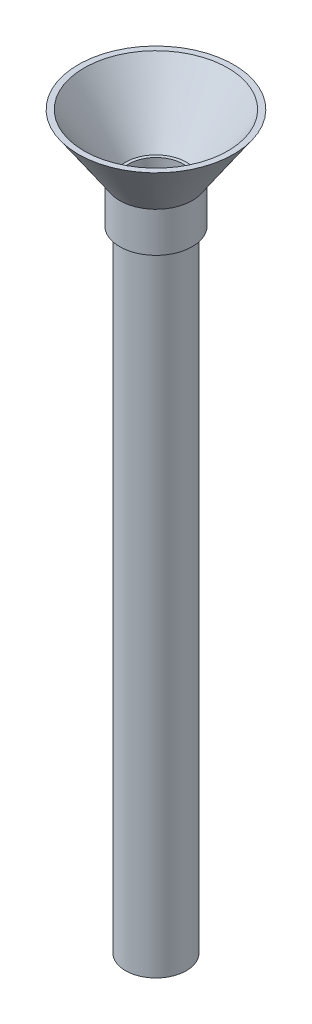
ISO-10303-21;
HEADER;
FILE_DESCRIPTION(('STEP AP214'),'2;1');
FILE_NAME('part.step','',(''),(''),'','','');
FILE_SCHEMA(('AUTOMOTIVE_DESIGN { 1 0 10303 214 1 1 1 1 }'));
ENDSEC;
DATA;
#1=APPLICATION_CONTEXT('core data for automotive mechanical design processes');
#2=APPLICATION_PROTOCOL_DEFINITION('international standard','automotive_design',2000,#1);
#3=PRODUCT_CONTEXT('',#1,'mechanical');
#4=PRODUCT('Part','Part','',(#3));
#5=PRODUCT_RELATED_PRODUCT_CATEGORY('part','',(#4));
#6=PRODUCT_DEFINITION_FORMATION('','',#4);
#7=PRODUCT_DEFINITION_CONTEXT('part definition',#1,'design');
#8=PRODUCT_DEFINITION('design','',#6,#7);
#9=PRODUCT_DEFINITION_SHAPE('','',#8);
#10=(LENGTH_UNIT() NAMED_UNIT(*) SI_UNIT(.MILLI.,.METRE.));
#11=(NAMED_UNIT(*) PLANE_ANGLE_UNIT() SI_UNIT($,.RADIAN.));
#12=(NAMED_UNIT(*) SI_UNIT($,.STERADIAN.) SOLID_ANGLE_UNIT());
#13=UNCERTAINTY_MEASURE_WITH_UNIT(LENGTH_MEASURE(1.E-05),#10,'distance_accuracy_value','');
#14=(GEOMETRIC_REPRESENTATION_CONTEXT(3) GLOBAL_UNCERTAINTY_ASSIGNED_CONTEXT((#13)) GLOBAL_UNIT_ASSIGNED_CONTEXT((#10,
#11,#12)) REPRESENTATION_CONTEXT('',''));
#15=CARTESIAN_POINT('',(0.,0.,0.));
#16=DIRECTION('',(0.,0.,1.));
#17=DIRECTION('',(1.,0.,0.));
#18=AXIS2_PLACEMENT_3D('',#15,#16,#17);
#19=CARTESIAN_POINT('',(0.,838.2,0.));
#20=DIRECTION('',(0.,1.,0.));
#21=DIRECTION('',(0.,0.,1.));
#22=AXIS2_PLACEMENT_3D('',#19,#20,#21);
#23=PLANE('',#22);
#24=CARTESIAN_POINT('',(0.,838.2,0.));
#25=DIRECTION('',(0.,1.,0.));
#26=DIRECTION('',(0.,0.,1.));
#27=AXIS2_PLACEMENT_3D('',#24,#25,#26);
#28=CIRCLE('',#27,38.1);
#29=CARTESIAN_POINT('',(0.,838.2,38.1));
#30=VERTEX_POINT('',#29);
#31=EDGE_CURVE('E68',#30,#30,#28,.T.);
#32=ORIENTED_EDGE('',*,*,#31,.T.);
#33=EDGE_LOOP('',(#32));
#34=FACE_BOUND('',#33,.T.);
#35=CARTESIAN_POINT('',(0.,838.2,0.));
#36=DIRECTION('',(0.,1.,0.));
#37=DIRECTION('',(0.,0.,1.));
#38=AXIS2_PLACEMENT_3D('',#35,#36,#37);
#39=CIRCLE('',#38,34.121686746988);
#40=CARTESIAN_POINT('',(0.,838.2,34.121686746988));
#41=VERTEX_POINT('',#40);
#42=EDGE_CURVE('E41',#41,#41,#39,.T.);
#43=ORIENTED_EDGE('',*,*,#42,.F.);
#44=EDGE_LOOP('',(#43));
#45=FACE_BOUND('',#44,.T.);
#46=ADVANCED_FACE('F34',(#34,#45),#23,.T.);
#47=CARTESIAN_POINT('',(0.,0.,0.));
#48=DIRECTION('',(0.,1.,0.));
#49=DIRECTION('',(0.,0.,1.));
#50=AXIS2_PLACEMENT_3D('',#47,#48,#49);
#51=PLANE('',#50);
#52=CARTESIAN_POINT('',(0.,0.,0.));
#53=DIRECTION('',(0.,1.,0.));
#54=DIRECTION('',(0.,0.,1.));
#55=AXIS2_PLACEMENT_3D('',#52,#53,#54);
#56=CIRCLE('',#55,38.1);
#57=CARTESIAN_POINT('',(0.,0.,38.1));
#58=VERTEX_POINT('',#57);
#59=EDGE_CURVE('E10',#58,#58,#56,.T.);
#60=ORIENTED_EDGE('',*,*,#59,.F.);
#61=EDGE_LOOP('',(#60));
#62=FACE_BOUND('',#61,.T.);
#63=CARTESIAN_POINT('',(0.,0.,0.));
#64=DIRECTION('',(0.,1.,0.));
#65=DIRECTION('',(0.,0.,1.));
#66=AXIS2_PLACEMENT_3D('',#63,#64,#65);
#67=CIRCLE('',#66,34.121686746988);
#68=CARTESIAN_POINT('',(0.,0.,34.121686746988));
#69=VERTEX_POINT('',#68);
#70=EDGE_CURVE('E45',#69,#69,#67,.T.);
#71=ORIENTED_EDGE('',*,*,#70,.T.);
#72=EDGE_LOOP('',(#71));
#73=FACE_BOUND('',#72,.T.);
#74=ADVANCED_FACE('F86',(#62,#73),#51,.F.);
#75=CARTESIAN_POINT('',(0.,838.2,0.));
#76=DIRECTION('',(0.,-1.,0.));
#77=DIRECTION('',(0.,0.,-1.));
#78=AXIS2_PLACEMENT_3D('',#75,#76,#77);
#79=CYLINDRICAL_SURFACE('',#78,38.1);
#80=CARTESIAN_POINT('',(0.,788.271478615059,0.));
#81=DIRECTION('',(0.,1.,0.));
#82=DIRECTION('',(0.,0.,1.));
#83=AXIS2_PLACEMENT_3D('',#80,#81,#82);
#84=CIRCLE('',#83,38.1);
#85=CARTESIAN_POINT('',(0.,788.271478615059,38.1));
#86=VERTEX_POINT('',#85);
#87=EDGE_CURVE('E50',#86,#86,#84,.T.);
#88=ORIENTED_EDGE('',*,*,#87,.F.);
#89=EDGE_LOOP('',(#88));
#90=FACE_BOUND('',#89,.T.);
#91=ORIENTED_EDGE('',*,*,#59,.T.);
#92=EDGE_LOOP('',(#91));
#93=FACE_BOUND('',#92,.T.);
#94=ADVANCED_FACE('F36',(#90,#93),#79,.T.);
#95=CARTESIAN_POINT('',(0.,838.2,0.));
#96=DIRECTION('',(0.,-1.,0.));
#97=DIRECTION('',(0.,0.,-1.));
#98=AXIS2_PLACEMENT_3D('',#95,#96,#97);
#99=CYLINDRICAL_SURFACE('',#98,34.121686746988);
#100=ORIENTED_EDGE('',*,*,#42,.T.);
#101=EDGE_LOOP('',(#100));
#102=FACE_BOUND('',#101,.T.);
#103=ORIENTED_EDGE('',*,*,#70,.F.);
#104=EDGE_LOOP('',(#103));
#105=FACE_BOUND('',#104,.T.);
#106=ADVANCED_FACE('F93',(#102,#105),#99,.F.);
#107=CARTESIAN_POINT('',(0.,788.271478615059,38.1));
#108=DIRECTION('',(0.,-1.,0.));
#109=DIRECTION('',(0.,0.,-1.));
#110=AXIS2_PLACEMENT_3D('',#107,#108,#109);
#111=PLANE('',#110);
#112=ORIENTED_EDGE('',*,*,#87,.T.);
#113=EDGE_LOOP('',(#112));
#114=FACE_BOUND('',#113,.T.);
#115=CARTESIAN_POINT('',(0.,788.271478615059,0.));
#116=DIRECTION('',(0.,1.,0.));
#117=DIRECTION('',(0.,0.,1.));
#118=AXIS2_PLACEMENT_3D('',#115,#116,#117);
#119=CIRCLE('',#118,45.313643111478);
#120=CARTESIAN_POINT('',(0.,788.271478615059,45.313643111478));
#121=VERTEX_POINT('',#120);
#122=EDGE_CURVE('E55',#121,#121,#119,.T.);
#123=ORIENTED_EDGE('',*,*,#122,.F.);
#124=EDGE_LOOP('',(#123));
#125=FACE_BOUND('',#124,.T.);
#126=ADVANCED_FACE('F96',(#114,#125),#111,.T.);
#127=CARTESIAN_POINT('',(0.,838.2,0.));
#128=DIRECTION('',(0.,1.,0.));
#129=DIRECTION('',(0.,0.,1.));
#130=AXIS2_PLACEMENT_3D('',#127,#128,#129);
#131=CYLINDRICAL_SURFACE('',#130,45.313643111478);
#132=ORIENTED_EDGE('',*,*,#122,.T.);
#133=EDGE_LOOP('',(#132));
#134=FACE_BOUND('',#133,.T.);
#135=CARTESIAN_POINT('',(0.,838.2,0.));
#136=DIRECTION('',(0.,1.,0.));
#137=DIRECTION('',(0.,0.,1.));
#138=AXIS2_PLACEMENT_3D('',#135,#136,#137);
#139=CIRCLE('',#138,45.313643111478);
#140=CARTESIAN_POINT('',(0.,838.2,45.313643111478));
#141=VERTEX_POINT('',#140);
#142=EDGE_CURVE('E59',#141,#141,#139,.T.);
#143=ORIENTED_EDGE('',*,*,#142,.F.);
#144=EDGE_LOOP('',(#143));
#145=FACE_BOUND('',#144,.T.);
#146=ADVANCED_FACE('F99',(#134,#145),#131,.T.);
#147=CARTESIAN_POINT('',(0.,914.4,0.));
#148=DIRECTION('',(0.,1.,0.));
#149=DIRECTION('',(0.,0.,1.));
#150=AXIS2_PLACEMENT_3D('',#147,#148,#149);
#151=CONICAL_SURFACE('',#150,97.2342270001348,0.598114579466968);
#152=ORIENTED_EDGE('',*,*,#142,.T.);
#153=EDGE_LOOP('',(#152));
#154=FACE_BOUND('',#153,.T.);
#155=CARTESIAN_POINT('',(0.,914.4,0.));
#156=DIRECTION('',(0.,1.,0.));
#157=DIRECTION('',(0.,0.,1.));
#158=AXIS2_PLACEMENT_3D('',#155,#156,#157);
#159=CIRCLE('',#158,97.2342270001348);
#160=CARTESIAN_POINT('',(0.,914.4,97.2342270001348));
#161=VERTEX_POINT('',#160);
#162=EDGE_CURVE('E62',#161,#161,#159,.T.);
#163=ORIENTED_EDGE('',*,*,#162,.F.);
#164=EDGE_LOOP('',(#163));
#165=FACE_BOUND('',#164,.T.);
#166=ADVANCED_FACE('F82',(#154,#165),#151,.T.);
#167=CARTESIAN_POINT('',(0.,914.4,97.2342270001348));
#168=DIRECTION('',(0.,1.,0.));
#169=DIRECTION('',(0.,0.,1.));
#170=AXIS2_PLACEMENT_3D('',#167,#168,#169);
#171=PLANE('',#170);
#172=ORIENTED_EDGE('',*,*,#162,.T.);
#173=EDGE_LOOP('',(#172));
#174=FACE_BOUND('',#173,.T.);
#175=CARTESIAN_POINT('',(0.,914.4,0.));
#176=DIRECTION('',(0.,1.,0.));
#177=DIRECTION('',(0.,0.,1.));
#178=AXIS2_PLACEMENT_3D('',#175,#176,#177);
#179=CIRCLE('',#178,90.0205838886568);
#180=CARTESIAN_POINT('',(0.,914.4,90.0205838886568));
#181=VERTEX_POINT('',#180);
#182=EDGE_CURVE('E65',#181,#181,#179,.T.);
#183=ORIENTED_EDGE('',*,*,#182,.F.);
#184=EDGE_LOOP('',(#183));
#185=FACE_BOUND('',#184,.T.);
#186=ADVANCED_FACE('F76',(#174,#185),#171,.T.);
#187=CARTESIAN_POINT('',(0.,838.2,0.));
#188=DIRECTION('',(0.,1.,0.));
#189=DIRECTION('',(0.,0.,1.));
#190=AXIS2_PLACEMENT_3D('',#187,#188,#189);
#191=CONICAL_SURFACE('',#190,38.1,0.598114579466969);
#192=ORIENTED_EDGE('',*,*,#182,.T.);
#193=EDGE_LOOP('',(#192));
#194=FACE_BOUND('',#193,.T.);
#195=ORIENTED_EDGE('',*,*,#31,.F.);
#196=EDGE_LOOP('',(#195));
#197=FACE_BOUND('',#196,.T.);
#198=ADVANCED_FACE('F74',(#194,#197),#191,.F.);
#199=CLOSED_SHELL('',(#46,#74,#94,#106,#126,#146,#166,#186,#198));
#200=MANIFOLD_SOLID_BREP('B2',#199);
#201=ADVANCED_BREP_SHAPE_REPRESENTATION('',(#18,#200),#14);
#202=SHAPE_DEFINITION_REPRESENTATION(#9,#201);
ENDSEC;
END-ISO-10303-21;
